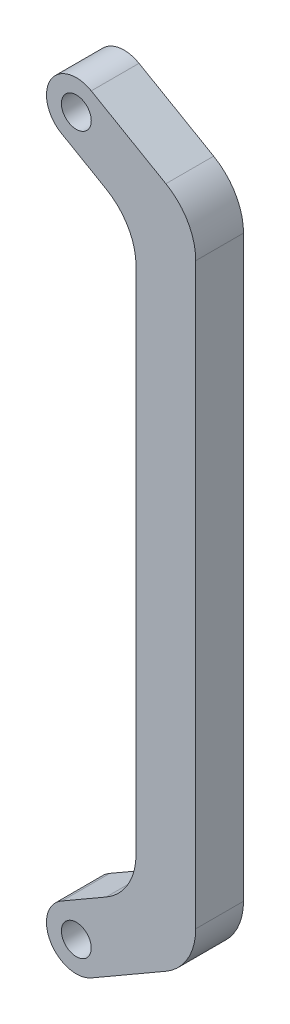
ISO-10303-21;
HEADER;
FILE_DESCRIPTION(('STEP AP214'),'2;1');
FILE_NAME('part.step','',(''),(''),'','','');
FILE_SCHEMA(('AUTOMOTIVE_DESIGN { 1 0 10303 214 1 1 1 1 }'));
ENDSEC;
DATA;
#1=APPLICATION_CONTEXT('core data for automotive mechanical design processes');
#2=APPLICATION_PROTOCOL_DEFINITION('international standard','automotive_design',2000,#1);
#3=PRODUCT_CONTEXT('',#1,'mechanical');
#4=PRODUCT('Part','Part','',(#3));
#5=PRODUCT_RELATED_PRODUCT_CATEGORY('part','',(#4));
#6=PRODUCT_DEFINITION_FORMATION('','',#4);
#7=PRODUCT_DEFINITION_CONTEXT('part definition',#1,'design');
#8=PRODUCT_DEFINITION('design','',#6,#7);
#9=PRODUCT_DEFINITION_SHAPE('','',#8);
#10=(LENGTH_UNIT() NAMED_UNIT(*) SI_UNIT(.MILLI.,.METRE.));
#11=(NAMED_UNIT(*) PLANE_ANGLE_UNIT() SI_UNIT($,.RADIAN.));
#12=(NAMED_UNIT(*) SI_UNIT($,.STERADIAN.) SOLID_ANGLE_UNIT());
#13=UNCERTAINTY_MEASURE_WITH_UNIT(LENGTH_MEASURE(1.E-05),#10,'distance_accuracy_value','');
#14=(GEOMETRIC_REPRESENTATION_CONTEXT(3) GLOBAL_UNCERTAINTY_ASSIGNED_CONTEXT((#13)) GLOBAL_UNIT_ASSIGNED_CONTEXT((#10,
#11,#12)) REPRESENTATION_CONTEXT('',''));
#15=CARTESIAN_POINT('',(0.,0.,0.));
#16=DIRECTION('',(0.,0.,1.));
#17=DIRECTION('',(1.,0.,0.));
#18=AXIS2_PLACEMENT_3D('',#15,#16,#17);
#19=CARTESIAN_POINT('',(12.5,12.9903810567665,138.612828501198));
#20=DIRECTION('',(0.499999999999998,-0.86602540378444,0.));
#21=DIRECTION('',(0.86602540378444,0.499999999999998,0.));
#22=AXIS2_PLACEMENT_3D('',#19,#20,#21);
#23=PLANE('',#22);
#24=DIRECTION('',(-0.86602540378444,-0.499999999999998,0.));
#25=VECTOR('',#24,1.);
#26=CARTESIAN_POINT('',(12.5,12.9903810567665,8.00000000000001));
#27=LINE('',#26,#25);
#28=CARTESIAN_POINT('',(4.99999999999999,8.66025403784436,8.00000000000001));
#29=VERTEX_POINT('',#28);
#30=CARTESIAN_POINT('',(-2.4027615221447,4.38626768028754,8.));
#31=VERTEX_POINT('',#30);
#32=EDGE_CURVE('E180',#29,#31,#27,.T.);
#33=ORIENTED_EDGE('',*,*,#32,.F.);
#34=DIRECTION('',(0.,0.,-1.));
#35=VECTOR('',#34,1.);
#36=CARTESIAN_POINT('',(4.99999999999999,8.66025403784436,0.));
#37=LINE('',#36,#35);
#38=CARTESIAN_POINT('',(4.99999999999999,8.66025403784436,0.));
#39=VERTEX_POINT('',#38);
#40=EDGE_CURVE('E137',#29,#39,#37,.T.);
#41=ORIENTED_EDGE('',*,*,#40,.T.);
#42=DIRECTION('',(-0.86602540378444,-0.499999999999998,0.));
#43=VECTOR('',#42,1.);
#44=CARTESIAN_POINT('',(12.5,12.9903810567665,0.));
#45=LINE('',#44,#43);
#46=CARTESIAN_POINT('',(-2.4027615221447,4.38626768028754,0.));
#47=VERTEX_POINT('',#46);
#48=EDGE_CURVE('E132',#39,#47,#45,.T.);
#49=ORIENTED_EDGE('',*,*,#48,.T.);
#50=DIRECTION('',(0.,0.,-1.));
#51=VECTOR('',#50,1.);
#52=CARTESIAN_POINT('',(-2.4027615221447,4.38626768028754,8.));
#53=LINE('',#52,#51);
#54=EDGE_CURVE('E135',#31,#47,#53,.T.);
#55=ORIENTED_EDGE('',*,*,#54,.F.);
#56=EDGE_LOOP('',(#33,#41,#49,#55));
#57=FACE_BOUND('',#56,.T.);
#58=ADVANCED_FACE('F41',(#57),#23,.F.);
#59=CARTESIAN_POINT('',(17.5,4.33012701892215,138.612828501198));
#60=DIRECTION('',(0.499999999999998,-0.86602540378444,0.));
#61=DIRECTION('',(0.86602540378444,0.499999999999998,0.));
#62=AXIS2_PLACEMENT_3D('',#59,#60,#61);
#63=PLANE('',#62);
#64=DIRECTION('',(-0.86602540378444,-0.499999999999998,0.));
#65=VECTOR('',#64,1.);
#66=CARTESIAN_POINT('',(17.5,4.33012701892215,0.));
#67=LINE('',#66,#65);
#68=CARTESIAN_POINT('',(15.,2.88675134594809,0.));
#69=VERTEX_POINT('',#68);
#70=CARTESIAN_POINT('',(2.5972384778552,-4.2739863575569,0.));
#71=VERTEX_POINT('',#70);
#72=EDGE_CURVE('E154',#69,#71,#67,.T.);
#73=ORIENTED_EDGE('',*,*,#72,.F.);
#74=DIRECTION('',(0.,0.,-1.));
#75=VECTOR('',#74,1.);
#76=CARTESIAN_POINT('',(15.,2.88675134594809,138.612828501198));
#77=LINE('',#76,#75);
#78=CARTESIAN_POINT('',(15.,2.88675134594809,8.00000000000001));
#79=VERTEX_POINT('',#78);
#80=EDGE_CURVE('E64',#69,#79,#77,.F.);
#81=ORIENTED_EDGE('',*,*,#80,.T.);
#82=DIRECTION('',(-0.86602540378444,-0.499999999999998,0.));
#83=VECTOR('',#82,1.);
#84=CARTESIAN_POINT('',(17.5,4.33012701892215,8.00000000000001));
#85=LINE('',#84,#83);
#86=CARTESIAN_POINT('',(2.5972384778552,-4.2739863575569,8.));
#87=VERTEX_POINT('',#86);
#88=EDGE_CURVE('E140',#79,#87,#85,.T.);
#89=ORIENTED_EDGE('',*,*,#88,.T.);
#90=DIRECTION('',(0.,0.,-1.));
#91=VECTOR('',#90,1.);
#92=CARTESIAN_POINT('',(2.5972384778552,-4.2739863575569,8.));
#93=LINE('',#92,#91);
#94=EDGE_CURVE('E197',#87,#71,#93,.T.);
#95=ORIENTED_EDGE('',*,*,#94,.T.);
#96=EDGE_LOOP('',(#73,#81,#89,#95));
#97=FACE_BOUND('',#96,.T.);
#98=ADVANCED_FACE('F267',(#97),#63,.T.);
#99=CARTESIAN_POINT('',(-7.77763270454201E-12,120.000000000001,8.));
#100=DIRECTION('',(0.,0.,-1.));
#101=DIRECTION('',(-1.,0.,0.));
#102=AXIS2_PLACEMENT_3D('',#99,#100,#101);
#103=CYLINDRICAL_SURFACE('',#102,4.99999999999361);
#104=CARTESIAN_POINT('',(-7.77763270454201E-12,120.000000000001,8.));
#105=DIRECTION('',(0.,0.,1.));
#106=DIRECTION('',(1.,0.,0.));
#107=AXIS2_PLACEMENT_3D('',#104,#105,#106);
#108=CIRCLE('',#107,4.99999999999361);
#109=CARTESIAN_POINT('',(2.49999999998901,124.330127018918,8.));
#110=VERTEX_POINT('',#109);
#111=CARTESIAN_POINT('',(-2.50000000000777,115.669872981079,8.00000000000001));
#112=VERTEX_POINT('',#111);
#113=EDGE_CURVE('E194',#110,#112,#108,.T.);
#114=ORIENTED_EDGE('',*,*,#113,.F.);
#115=DIRECTION('',(0.,0.,-1.));
#116=VECTOR('',#115,1.);
#117=CARTESIAN_POINT('',(2.49999999999221,124.330127018923,138.612828501198));
#118=LINE('',#117,#116);
#119=CARTESIAN_POINT('',(2.49999999999221,124.330127018923,0.));
#120=VERTEX_POINT('',#119);
#121=EDGE_CURVE('E183',#110,#120,#118,.T.);
#122=ORIENTED_EDGE('',*,*,#121,.T.);
#123=CARTESIAN_POINT('',(-7.77763270454201E-12,120.000000000001,0.));
#124=DIRECTION('',(0.,0.,1.));
#125=DIRECTION('',(1.,0.,0.));
#126=AXIS2_PLACEMENT_3D('',#123,#124,#125);
#127=CIRCLE('',#126,4.99999999999361);
#128=CARTESIAN_POINT('',(-2.50000000000777,115.669872981079,0.));
#129=VERTEX_POINT('',#128);
#130=EDGE_CURVE('E179',#120,#129,#127,.T.);
#131=ORIENTED_EDGE('',*,*,#130,.T.);
#132=DIRECTION('',(0.,0.,-1.));
#133=VECTOR('',#132,1.);
#134=CARTESIAN_POINT('',(-2.50000000000777,115.669872981079,138.612828501198));
#135=LINE('',#134,#133);
#136=EDGE_CURVE('E169',#112,#129,#135,.T.);
#137=ORIENTED_EDGE('',*,*,#136,.F.);
#138=EDGE_LOOP('',(#114,#122,#131,#137));
#139=FACE_BOUND('',#138,.T.);
#140=ADVANCED_FACE('F249',(#139),#103,.T.);
#141=CARTESIAN_POINT('',(-7.77763270454201E-12,120.000000000001,8.));
#142=DIRECTION('',(0.,0.,1.));
#143=DIRECTION('',(1.,0.,0.));
#144=AXIS2_PLACEMENT_3D('',#141,#142,#143);
#145=PLANE('',#144);
#146=CARTESIAN_POINT('',(-7.77763270454201E-12,120.000000000001,8.));
#147=DIRECTION('',(0.,0.,1.));
#148=DIRECTION('',(1.,0.,0.));
#149=AXIS2_PLACEMENT_3D('',#146,#147,#148);
#150=CIRCLE('',#149,2.5);
#151=CARTESIAN_POINT('',(2.49999999999222,120.000000000001,8.));
#152=VERTEX_POINT('',#151);
#153=EDGE_CURVE('E414',#152,#152,#150,.T.);
#154=ORIENTED_EDGE('',*,*,#153,.F.);
#155=EDGE_LOOP('',(#154));
#156=FACE_BOUND('',#155,.T.);
#157=CARTESIAN_POINT('',(0.,0.,8.));
#158=DIRECTION('',(0.,0.,1.));
#159=DIRECTION('',(1.,0.,0.));
#160=AXIS2_PLACEMENT_3D('',#157,#158,#159);
#161=CIRCLE('',#160,2.5);
#162=CARTESIAN_POINT('',(2.5,0.,8.));
#163=VERTEX_POINT('',#162);
#164=EDGE_CURVE('E412',#163,#163,#161,.T.);
#165=ORIENTED_EDGE('',*,*,#164,.F.);
#166=EDGE_LOOP('',(#165));
#167=FACE_BOUND('',#166,.T.);
#168=ORIENTED_EDGE('',*,*,#88,.F.);
#169=CARTESIAN_POINT('',(10.,11.5470053837925,8.00000000000001));
#170=DIRECTION('',(0.,0.,1.));
#171=DIRECTION('',(1.,0.,0.));
#172=AXIS2_PLACEMENT_3D('',#169,#170,#171);
#173=CIRCLE('',#172,10.);
#174=CARTESIAN_POINT('',(20.,11.5470053837925,8.00000000000001));
#175=VERTEX_POINT('',#174);
#176=EDGE_CURVE('E220',#79,#175,#173,.T.);
#177=ORIENTED_EDGE('',*,*,#176,.T.);
#178=DIRECTION('',(0.,-1.,0.));
#179=VECTOR('',#178,1.);
#180=CARTESIAN_POINT('',(20.,111.339745962152,8.00000000000001));
#181=LINE('',#180,#179);
#182=CARTESIAN_POINT('',(20.,108.452994616204,8.00000000000001));
#183=VERTEX_POINT('',#182);
#184=EDGE_CURVE('E184',#183,#175,#181,.T.);
#185=ORIENTED_EDGE('',*,*,#184,.F.);
#186=CARTESIAN_POINT('',(10.,108.452994616204,8.00000000000001));
#187=DIRECTION('',(0.,0.,1.));
#188=DIRECTION('',(1.,0.,0.));
#189=AXIS2_PLACEMENT_3D('',#186,#187,#188);
#190=CIRCLE('',#189,10.);
#191=CARTESIAN_POINT('',(15.,117.113248654049,8.00000000000001));
#192=VERTEX_POINT('',#191);
#193=EDGE_CURVE('E56',#183,#192,#190,.T.);
#194=ORIENTED_EDGE('',*,*,#193,.T.);
#195=DIRECTION('',(0.86602540378444,-0.499999999999998,0.));
#196=VECTOR('',#195,1.);
#197=CARTESIAN_POINT('',(2.49999999999221,124.330127018923,8.00000000000001));
#198=LINE('',#197,#196);
#199=EDGE_CURVE('E181',#110,#192,#198,.T.);
#200=ORIENTED_EDGE('',*,*,#199,.F.);
#201=ORIENTED_EDGE('',*,*,#113,.T.);
#202=DIRECTION('',(0.86602540378444,-0.499999999999998,0.));
#203=VECTOR('',#202,1.);
#204=CARTESIAN_POINT('',(-2.50000000000777,115.669872981079,8.00000000000001));
#205=LINE('',#204,#203);
#206=CARTESIAN_POINT('',(4.99999999999998,111.339745962152,8.00000000000001));
#207=VERTEX_POINT('',#206);
#208=EDGE_CURVE('E176',#112,#207,#205,.T.);
#209=ORIENTED_EDGE('',*,*,#208,.T.);
#210=CARTESIAN_POINT('',(0.,102.679491924308,8.00000000000001));
#211=DIRECTION('',(0.,0.,1.));
#212=DIRECTION('',(1.,0.,0.));
#213=AXIS2_PLACEMENT_3D('',#210,#211,#212);
#214=CIRCLE('',#213,10.);
#215=CARTESIAN_POINT('',(10.,102.679491924308,8.00000000000001));
#216=VERTEX_POINT('',#215);
#217=EDGE_CURVE('E227',#207,#216,#214,.F.);
#218=ORIENTED_EDGE('',*,*,#217,.T.);
#219=DIRECTION('',(0.,-1.,0.));
#220=VECTOR('',#219,1.);
#221=CARTESIAN_POINT('',(10.,111.339745962152,8.00000000000001));
#222=LINE('',#221,#220);
#223=CARTESIAN_POINT('',(10.,17.3205080756888,8.00000000000001));
#224=VERTEX_POINT('',#223);
#225=EDGE_CURVE('E174',#216,#224,#222,.T.);
#226=ORIENTED_EDGE('',*,*,#225,.T.);
#227=CARTESIAN_POINT('',(0.,17.3205080756888,8.00000000000001));
#228=DIRECTION('',(0.,0.,1.));
#229=DIRECTION('',(1.,0.,0.));
#230=AXIS2_PLACEMENT_3D('',#227,#228,#229);
#231=CIRCLE('',#230,10.);
#232=EDGE_CURVE('E11',#224,#29,#231,.F.);
#233=ORIENTED_EDGE('',*,*,#232,.T.);
#234=ORIENTED_EDGE('',*,*,#32,.T.);
#235=CARTESIAN_POINT('',(0.,0.,8.));
#236=DIRECTION('',(0.,0.,1.));
#237=DIRECTION('',(1.,0.,0.));
#238=AXIS2_PLACEMENT_3D('',#235,#236,#237);
#239=CIRCLE('',#238,5.00126055064462);
#240=EDGE_CURVE('E150',#31,#87,#239,.T.);
#241=ORIENTED_EDGE('',*,*,#240,.T.);
#242=EDGE_LOOP('',(#168,#177,#185,#194,#200,#201,#209,#218,#226,#233,#234,#241));
#243=FACE_BOUND('',#242,.T.);
#244=ADVANCED_FACE('F237',(#156,#167,#243),#145,.T.);
#245=CARTESIAN_POINT('',(-7.77763270454201E-12,120.000000000001,0.));
#246=DIRECTION('',(0.,0.,1.));
#247=DIRECTION('',(1.,0.,0.));
#248=AXIS2_PLACEMENT_3D('',#245,#246,#247);
#249=PLANE('',#248);
#250=CARTESIAN_POINT('',(-7.77763270454201E-12,120.000000000001,0.));
#251=DIRECTION('',(0.,0.,1.));
#252=DIRECTION('',(1.,0.,0.));
#253=AXIS2_PLACEMENT_3D('',#250,#251,#252);
#254=CIRCLE('',#253,2.5);
#255=CARTESIAN_POINT('',(2.49999999999222,120.000000000001,0.));
#256=VERTEX_POINT('',#255);
#257=EDGE_CURVE('E156',#256,#256,#254,.T.);
#258=ORIENTED_EDGE('',*,*,#257,.T.);
#259=EDGE_LOOP('',(#258));
#260=FACE_BOUND('',#259,.T.);
#261=CARTESIAN_POINT('',(0.,0.,0.));
#262=DIRECTION('',(0.,0.,1.));
#263=DIRECTION('',(1.,0.,0.));
#264=AXIS2_PLACEMENT_3D('',#261,#262,#263);
#265=CIRCLE('',#264,2.5);
#266=CARTESIAN_POINT('',(2.5,0.,0.));
#267=VERTEX_POINT('',#266);
#268=EDGE_CURVE('E159',#267,#267,#265,.T.);
#269=ORIENTED_EDGE('',*,*,#268,.T.);
#270=EDGE_LOOP('',(#269));
#271=FACE_BOUND('',#270,.T.);
#272=DIRECTION('',(0.,-1.,0.));
#273=VECTOR('',#272,1.);
#274=CARTESIAN_POINT('',(20.,111.339745962152,0.));
#275=LINE('',#274,#273);
#276=CARTESIAN_POINT('',(20.,108.452994616204,0.));
#277=VERTEX_POINT('',#276);
#278=CARTESIAN_POINT('',(20.,11.5470053837925,0.));
#279=VERTEX_POINT('',#278);
#280=EDGE_CURVE('E172',#277,#279,#275,.T.);
#281=ORIENTED_EDGE('',*,*,#280,.T.);
#282=CARTESIAN_POINT('',(10.,11.5470053837925,0.));
#283=DIRECTION('',(0.,0.,1.));
#284=DIRECTION('',(1.,0.,0.));
#285=AXIS2_PLACEMENT_3D('',#282,#283,#284);
#286=CIRCLE('',#285,10.);
#287=EDGE_CURVE('E216',#279,#69,#286,.F.);
#288=ORIENTED_EDGE('',*,*,#287,.T.);
#289=ORIENTED_EDGE('',*,*,#72,.T.);
#290=CARTESIAN_POINT('',(0.,0.,0.));
#291=DIRECTION('',(0.,0.,1.));
#292=DIRECTION('',(1.,0.,0.));
#293=AXIS2_PLACEMENT_3D('',#290,#291,#292);
#294=CIRCLE('',#293,5.00126055064462);
#295=EDGE_CURVE('E147',#47,#71,#294,.T.);
#296=ORIENTED_EDGE('',*,*,#295,.F.);
#297=ORIENTED_EDGE('',*,*,#48,.F.);
#298=CARTESIAN_POINT('',(0.,17.3205080756888,0.));
#299=DIRECTION('',(0.,0.,1.));
#300=DIRECTION('',(1.,0.,0.));
#301=AXIS2_PLACEMENT_3D('',#298,#299,#300);
#302=CIRCLE('',#301,10.);
#303=CARTESIAN_POINT('',(10.,17.3205080756888,0.));
#304=VERTEX_POINT('',#303);
#305=EDGE_CURVE('E49',#39,#304,#302,.T.);
#306=ORIENTED_EDGE('',*,*,#305,.T.);
#307=DIRECTION('',(0.,-1.,0.));
#308=VECTOR('',#307,1.);
#309=CARTESIAN_POINT('',(10.,111.339745962152,0.));
#310=LINE('',#309,#308);
#311=CARTESIAN_POINT('',(10.,102.679491924308,0.));
#312=VERTEX_POINT('',#311);
#313=EDGE_CURVE('E162',#312,#304,#310,.T.);
#314=ORIENTED_EDGE('',*,*,#313,.F.);
#315=CARTESIAN_POINT('',(0.,102.679491924308,0.));
#316=DIRECTION('',(0.,0.,1.));
#317=DIRECTION('',(1.,0.,0.));
#318=AXIS2_PLACEMENT_3D('',#315,#316,#317);
#319=CIRCLE('',#318,10.);
#320=CARTESIAN_POINT('',(4.99999999999998,111.339745962152,0.));
#321=VERTEX_POINT('',#320);
#322=EDGE_CURVE('E225',#312,#321,#319,.T.);
#323=ORIENTED_EDGE('',*,*,#322,.T.);
#324=DIRECTION('',(0.86602540378444,-0.499999999999998,0.));
#325=VECTOR('',#324,1.);
#326=CARTESIAN_POINT('',(-2.50000000000777,115.669872981079,0.));
#327=LINE('',#326,#325);
#328=EDGE_CURVE('E166',#129,#321,#327,.T.);
#329=ORIENTED_EDGE('',*,*,#328,.F.);
#330=ORIENTED_EDGE('',*,*,#130,.F.);
#331=DIRECTION('',(0.86602540378444,-0.499999999999998,0.));
#332=VECTOR('',#331,1.);
#333=CARTESIAN_POINT('',(2.49999999999221,124.330127018923,0.));
#334=LINE('',#333,#332);
#335=CARTESIAN_POINT('',(15.,117.113248654049,0.));
#336=VERTEX_POINT('',#335);
#337=EDGE_CURVE('E165',#120,#336,#334,.T.);
#338=ORIENTED_EDGE('',*,*,#337,.T.);
#339=CARTESIAN_POINT('',(10.,108.452994616204,0.));
#340=DIRECTION('',(0.,0.,1.));
#341=DIRECTION('',(1.,0.,0.));
#342=AXIS2_PLACEMENT_3D('',#339,#340,#341);
#343=CIRCLE('',#342,10.);
#344=EDGE_CURVE('E214',#336,#277,#343,.F.);
#345=ORIENTED_EDGE('',*,*,#344,.T.);
#346=EDGE_LOOP('',(#281,#288,#289,#296,#297,#306,#314,#323,#329,#330,#338,#345));
#347=FACE_BOUND('',#346,.T.);
#348=ADVANCED_FACE('F153',(#260,#271,#347),#249,.F.);
#349=CARTESIAN_POINT('',(20.,111.339745962152,138.612828501198));
#350=DIRECTION('',(1.,0.,0.));
#351=DIRECTION('',(0.,1.,0.));
#352=AXIS2_PLACEMENT_3D('',#349,#350,#351);
#353=PLANE('',#352);
#354=ORIENTED_EDGE('',*,*,#184,.T.);
#355=DIRECTION('',(0.,0.,-1.));
#356=VECTOR('',#355,1.);
#357=CARTESIAN_POINT('',(20.,11.5470053837925,138.612828501198));
#358=LINE('',#357,#356);
#359=EDGE_CURVE('E211',#175,#279,#358,.T.);
#360=ORIENTED_EDGE('',*,*,#359,.T.);
#361=ORIENTED_EDGE('',*,*,#280,.F.);
#362=DIRECTION('',(0.,0.,-1.));
#363=VECTOR('',#362,1.);
#364=CARTESIAN_POINT('',(20.,108.452994616204,138.612828501198));
#365=LINE('',#364,#363);
#366=EDGE_CURVE('E209',#277,#183,#365,.F.);
#367=ORIENTED_EDGE('',*,*,#366,.T.);
#368=EDGE_LOOP('',(#354,#360,#361,#367));
#369=FACE_BOUND('',#368,.T.);
#370=ADVANCED_FACE('F258',(#369),#353,.T.);
#371=CARTESIAN_POINT('',(2.49999999999221,124.330127018923,138.612828501198));
#372=DIRECTION('',(0.499999999999998,0.86602540378444,0.));
#373=DIRECTION('',(-0.86602540378444,0.499999999999998,0.));
#374=AXIS2_PLACEMENT_3D('',#371,#372,#373);
#375=PLANE('',#374);
#376=ORIENTED_EDGE('',*,*,#199,.T.);
#377=DIRECTION('',(0.,0.,-1.));
#378=VECTOR('',#377,1.);
#379=CARTESIAN_POINT('',(15.,117.113248654049,138.612828501198));
#380=LINE('',#379,#378);
#381=EDGE_CURVE('E222',#192,#336,#380,.T.);
#382=ORIENTED_EDGE('',*,*,#381,.T.);
#383=ORIENTED_EDGE('',*,*,#337,.F.);
#384=ORIENTED_EDGE('',*,*,#121,.F.);
#385=EDGE_LOOP('',(#376,#382,#383,#384));
#386=FACE_BOUND('',#385,.T.);
#387=ADVANCED_FACE('F253',(#386),#375,.T.);
#388=CARTESIAN_POINT('',(-2.50000000000777,115.669872981079,138.612828501198));
#389=DIRECTION('',(0.499999999999998,0.86602540378444,0.));
#390=DIRECTION('',(-0.86602540378444,0.499999999999998,0.));
#391=AXIS2_PLACEMENT_3D('',#388,#389,#390);
#392=PLANE('',#391);
#393=ORIENTED_EDGE('',*,*,#328,.T.);
#394=DIRECTION('',(0.,0.,-1.));
#395=VECTOR('',#394,1.);
#396=CARTESIAN_POINT('',(4.99999999999998,111.339745962152,8.00000000000001));
#397=LINE('',#396,#395);
#398=EDGE_CURVE('E206',#321,#207,#397,.F.);
#399=ORIENTED_EDGE('',*,*,#398,.T.);
#400=ORIENTED_EDGE('',*,*,#208,.F.);
#401=ORIENTED_EDGE('',*,*,#136,.T.);
#402=EDGE_LOOP('',(#393,#399,#400,#401));
#403=FACE_BOUND('',#402,.T.);
#404=ADVANCED_FACE('F245',(#403),#392,.F.);
#405=CARTESIAN_POINT('',(10.,111.339745962152,138.612828501198));
#406=DIRECTION('',(1.,0.,0.));
#407=DIRECTION('',(0.,1.,0.));
#408=AXIS2_PLACEMENT_3D('',#405,#406,#407);
#409=PLANE('',#408);
#410=ORIENTED_EDGE('',*,*,#225,.F.);
#411=DIRECTION('',(0.,0.,-1.));
#412=VECTOR('',#411,1.);
#413=CARTESIAN_POINT('',(10.,102.679491924308,0.));
#414=LINE('',#413,#412);
#415=EDGE_CURVE('E203',#216,#312,#414,.T.);
#416=ORIENTED_EDGE('',*,*,#415,.T.);
#417=ORIENTED_EDGE('',*,*,#313,.T.);
#418=DIRECTION('',(0.,0.,-1.));
#419=VECTOR('',#418,1.);
#420=CARTESIAN_POINT('',(10.,17.3205080756888,8.00000000000001));
#421=LINE('',#420,#419);
#422=EDGE_CURVE('E201',#304,#224,#421,.F.);
#423=ORIENTED_EDGE('',*,*,#422,.T.);
#424=EDGE_LOOP('',(#410,#416,#417,#423));
#425=FACE_BOUND('',#424,.T.);
#426=ADVANCED_FACE('F233',(#425),#409,.F.);
#427=CARTESIAN_POINT('',(0.,0.,8.));
#428=DIRECTION('',(0.,0.,-1.));
#429=DIRECTION('',(-1.,0.,0.));
#430=AXIS2_PLACEMENT_3D('',#427,#428,#429);
#431=CYLINDRICAL_SURFACE('',#430,5.00126055064462);
#432=ORIENTED_EDGE('',*,*,#240,.F.);
#433=ORIENTED_EDGE('',*,*,#54,.T.);
#434=ORIENTED_EDGE('',*,*,#295,.T.);
#435=ORIENTED_EDGE('',*,*,#94,.F.);
#436=EDGE_LOOP('',(#432,#433,#434,#435));
#437=FACE_BOUND('',#436,.T.);
#438=ADVANCED_FACE('F145',(#437),#431,.T.);
#439=CARTESIAN_POINT('',(0.,0.,0.));
#440=DIRECTION('',(0.,0.,1.));
#441=DIRECTION('',(1.,0.,0.));
#442=AXIS2_PLACEMENT_3D('',#439,#440,#441);
#443=CYLINDRICAL_SURFACE('',#442,2.5);
#444=ORIENTED_EDGE('',*,*,#268,.F.);
#445=EDGE_LOOP('',(#444));
#446=FACE_BOUND('',#445,.T.);
#447=ORIENTED_EDGE('',*,*,#164,.T.);
#448=EDGE_LOOP('',(#447));
#449=FACE_BOUND('',#448,.T.);
#450=ADVANCED_FACE('F315',(#446,#449),#443,.F.);
#451=CARTESIAN_POINT('',(-7.77763270454201E-12,120.000000000001,0.));
#452=DIRECTION('',(0.,0.,1.));
#453=DIRECTION('',(1.,0.,0.));
#454=AXIS2_PLACEMENT_3D('',#451,#452,#453);
#455=CYLINDRICAL_SURFACE('',#454,2.5);
#456=ORIENTED_EDGE('',*,*,#257,.F.);
#457=EDGE_LOOP('',(#456));
#458=FACE_BOUND('',#457,.T.);
#459=ORIENTED_EDGE('',*,*,#153,.T.);
#460=EDGE_LOOP('',(#459));
#461=FACE_BOUND('',#460,.T.);
#462=ADVANCED_FACE('F286',(#458,#461),#455,.F.);
#463=CARTESIAN_POINT('',(0.,102.679491924308,138.612828501198));
#464=DIRECTION('',(0.,0.,1.));
#465=DIRECTION('',(1.,0.,0.));
#466=AXIS2_PLACEMENT_3D('',#463,#464,#465);
#467=CYLINDRICAL_SURFACE('',#466,10.);
#468=ORIENTED_EDGE('',*,*,#217,.F.);
#469=ORIENTED_EDGE('',*,*,#398,.F.);
#470=ORIENTED_EDGE('',*,*,#322,.F.);
#471=ORIENTED_EDGE('',*,*,#415,.F.);
#472=EDGE_LOOP('',(#468,#469,#470,#471));
#473=FACE_BOUND('',#472,.T.);
#474=ADVANCED_FACE('F240',(#473),#467,.F.);
#475=CARTESIAN_POINT('',(0.,17.3205080756888,138.612828501198));
#476=DIRECTION('',(0.,0.,1.));
#477=DIRECTION('',(1.,0.,0.));
#478=AXIS2_PLACEMENT_3D('',#475,#476,#477);
#479=CYLINDRICAL_SURFACE('',#478,10.);
#480=ORIENTED_EDGE('',*,*,#232,.F.);
#481=ORIENTED_EDGE('',*,*,#422,.F.);
#482=ORIENTED_EDGE('',*,*,#305,.F.);
#483=ORIENTED_EDGE('',*,*,#40,.F.);
#484=EDGE_LOOP('',(#480,#481,#482,#483));
#485=FACE_BOUND('',#484,.T.);
#486=ADVANCED_FACE('F236',(#485),#479,.F.);
#487=CARTESIAN_POINT('',(10.,11.5470053837925,138.612828501198));
#488=DIRECTION('',(0.,0.,-1.));
#489=DIRECTION('',(-1.,0.,0.));
#490=AXIS2_PLACEMENT_3D('',#487,#488,#489);
#491=CYLINDRICAL_SURFACE('',#490,10.);
#492=ORIENTED_EDGE('',*,*,#176,.F.);
#493=ORIENTED_EDGE('',*,*,#80,.F.);
#494=ORIENTED_EDGE('',*,*,#287,.F.);
#495=ORIENTED_EDGE('',*,*,#359,.F.);
#496=EDGE_LOOP('',(#492,#493,#494,#495));
#497=FACE_BOUND('',#496,.T.);
#498=ADVANCED_FACE('F261',(#497),#491,.T.);
#499=CARTESIAN_POINT('',(10.,108.452994616204,138.612828501198));
#500=DIRECTION('',(0.,0.,-1.));
#501=DIRECTION('',(-1.,0.,0.));
#502=AXIS2_PLACEMENT_3D('',#499,#500,#501);
#503=CYLINDRICAL_SURFACE('',#502,10.);
#504=ORIENTED_EDGE('',*,*,#193,.F.);
#505=ORIENTED_EDGE('',*,*,#366,.F.);
#506=ORIENTED_EDGE('',*,*,#344,.F.);
#507=ORIENTED_EDGE('',*,*,#381,.F.);
#508=EDGE_LOOP('',(#504,#505,#506,#507));
#509=FACE_BOUND('',#508,.T.);
#510=ADVANCED_FACE('F43',(#509),#503,.T.);
#511=CLOSED_SHELL('',(#58,#98,#140,#244,#348,#370,#387,#404,#426,#438,#450,#462,#474,#486,#498,#510));
#512=MANIFOLD_SOLID_BREP('B2',#511);
#513=ADVANCED_BREP_SHAPE_REPRESENTATION('',(#18,#512),#14);
#514=SHAPE_DEFINITION_REPRESENTATION(#9,#513);
ENDSEC;
END-ISO-10303-21;
